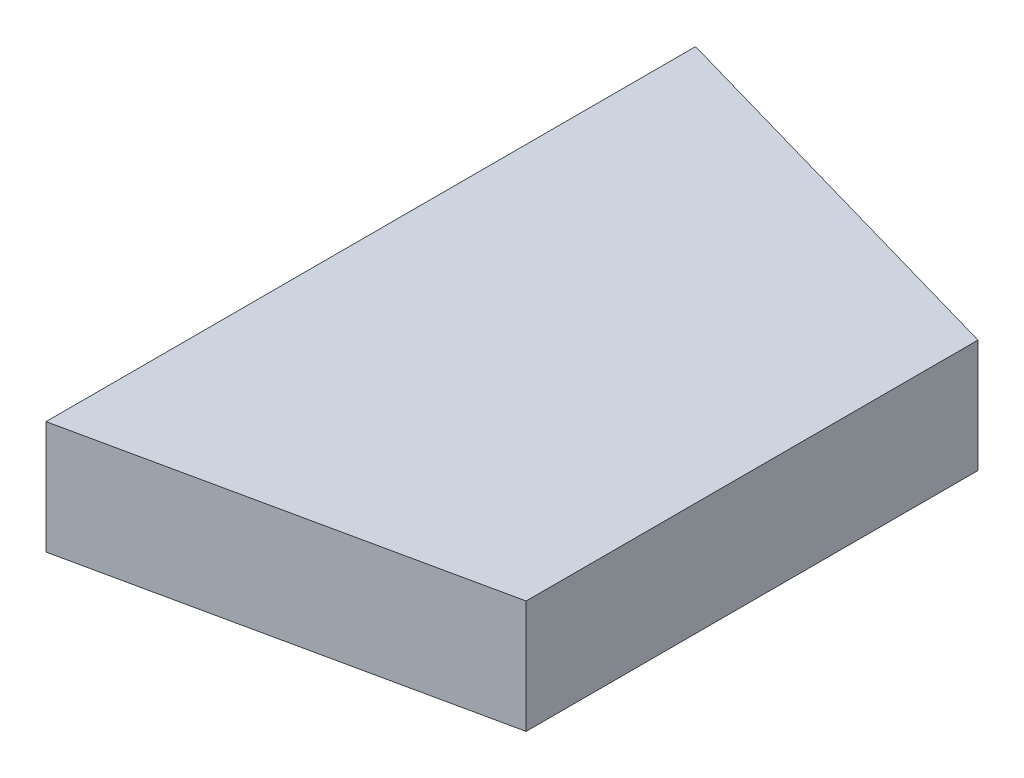
ISO-10303-21;
HEADER;
FILE_DESCRIPTION(('STEP AP214'),'2;1');
FILE_NAME('part.step','',(''),(''),'','','');
FILE_SCHEMA(('AUTOMOTIVE_DESIGN { 1 0 10303 214 1 1 1 1 }'));
ENDSEC;
DATA;
#1=APPLICATION_CONTEXT('core data for automotive mechanical design processes');
#2=APPLICATION_PROTOCOL_DEFINITION('international standard','automotive_design',2000,#1);
#3=PRODUCT_CONTEXT('',#1,'mechanical');
#4=PRODUCT('Part','Part','',(#3));
#5=PRODUCT_RELATED_PRODUCT_CATEGORY('part','',(#4));
#6=PRODUCT_DEFINITION_FORMATION('','',#4);
#7=PRODUCT_DEFINITION_CONTEXT('part definition',#1,'design');
#8=PRODUCT_DEFINITION('design','',#6,#7);
#9=PRODUCT_DEFINITION_SHAPE('','',#8);
#10=(LENGTH_UNIT() NAMED_UNIT(*) SI_UNIT(.MILLI.,.METRE.));
#11=(NAMED_UNIT(*) PLANE_ANGLE_UNIT() SI_UNIT($,.RADIAN.));
#12=(NAMED_UNIT(*) SI_UNIT($,.STERADIAN.) SOLID_ANGLE_UNIT());
#13=UNCERTAINTY_MEASURE_WITH_UNIT(LENGTH_MEASURE(1.E-05),#10,'distance_accuracy_value','');
#14=(GEOMETRIC_REPRESENTATION_CONTEXT(3) GLOBAL_UNCERTAINTY_ASSIGNED_CONTEXT((#13)) GLOBAL_UNIT_ASSIGNED_CONTEXT((#10,
#11,#12)) REPRESENTATION_CONTEXT('',''));
#15=CARTESIAN_POINT('',(0.,0.,0.));
#16=DIRECTION('',(0.,0.,1.));
#17=DIRECTION('',(1.,0.,0.));
#18=AXIS2_PLACEMENT_3D('',#15,#16,#17);
#19=CARTESIAN_POINT('',(0.,-4.,0.));
#20=DIRECTION('',(0.,-1.,0.));
#21=DIRECTION('',(0.,0.,-1.));
#22=AXIS2_PLACEMENT_3D('',#19,#20,#21);
#23=PLANE('',#22);
#24=CARTESIAN_POINT('',(80.,-4.,62.));
#25=DIRECTION('',(0.,1.,0.));
#26=DIRECTION('',(0.,0.,1.));
#27=AXIS2_PLACEMENT_3D('',#24,#25,#26);
#28=CIRCLE('',#27,3.00000000000001);
#29=CARTESIAN_POINT('',(80.,-4.,65.));
#30=VERTEX_POINT('',#29);
#31=EDGE_CURVE('E150',#30,#30,#28,.T.);
#32=ORIENTED_EDGE('',*,*,#31,.T.);
#33=EDGE_LOOP('',(#32));
#34=FACE_BOUND('',#33,.T.);
#35=CARTESIAN_POINT('',(100.,-4.,50.));
#36=DIRECTION('',(0.,1.,0.));
#37=DIRECTION('',(0.,0.,1.));
#38=AXIS2_PLACEMENT_3D('',#35,#36,#37);
#39=CIRCLE('',#38,3.00000000000001);
#40=CARTESIAN_POINT('',(100.,-4.,53.));
#41=VERTEX_POINT('',#40);
#42=EDGE_CURVE('E146',#41,#41,#39,.T.);
#43=ORIENTED_EDGE('',*,*,#42,.T.);
#44=EDGE_LOOP('',(#43));
#45=FACE_BOUND('',#44,.T.);
#46=DIRECTION('',(-0.961523947640823,0.,-0.274721127897378));
#47=VECTOR('',#46,1.);
#48=CARTESIAN_POINT('',(76.,-4.,20.));
#49=LINE('',#48,#47);
#50=CARTESIAN_POINT('',(79.5957594205331,-4.,21.027359834438));
#51=VERTEX_POINT('',#50);
#52=CARTESIAN_POINT('',(76.,-4.,20.));
#53=VERTEX_POINT('',#52);
#54=EDGE_CURVE('E118',#51,#53,#49,.T.);
#55=ORIENTED_EDGE('',*,*,#54,.F.);
#56=CARTESIAN_POINT('',(80.,-4.,24.));
#57=DIRECTION('',(0.,1.,0.));
#58=DIRECTION('',(0.,0.,1.));
#59=AXIS2_PLACEMENT_3D('',#56,#57,#58);
#60=CIRCLE('',#59,3.00000000000001);
#61=CARTESIAN_POINT('',(81.9136745417311,-4.,21.6896212976375));
#62=VERTEX_POINT('',#61);
#63=EDGE_CURVE('E47',#51,#62,#60,.T.);
#64=ORIENTED_EDGE('',*,*,#63,.T.);
#65=CARTESIAN_POINT('',(104.,-4.,28.));
#66=VERTEX_POINT('',#65);
#67=EDGE_CURVE('E113',#66,#62,#49,.T.);
#68=ORIENTED_EDGE('',*,*,#67,.F.);
#69=DIRECTION('',(0.,0.,-1.));
#70=VECTOR('',#69,1.);
#71=CARTESIAN_POINT('',(104.,-4.,28.));
#72=LINE('',#71,#70);
#73=CARTESIAN_POINT('',(104.,-4.,60.));
#74=VERTEX_POINT('',#73);
#75=EDGE_CURVE('E127',#74,#66,#72,.T.);
#76=ORIENTED_EDGE('',*,*,#75,.F.);
#77=DIRECTION('',(0.977802414077409,0.,-0.209529088730874));
#78=VECTOR('',#77,1.);
#79=CARTESIAN_POINT('',(104.,-4.,60.));
#80=LINE('',#79,#78);
#81=CARTESIAN_POINT('',(76.,-4.,66.));
#82=VERTEX_POINT('',#81);
#83=EDGE_CURVE('E108',#82,#74,#80,.T.);
#84=ORIENTED_EDGE('',*,*,#83,.F.);
#85=DIRECTION('',(0.,0.,1.));
#86=VECTOR('',#85,1.);
#87=CARTESIAN_POINT('',(76.,-4.,66.));
#88=LINE('',#87,#86);
#89=EDGE_CURVE('E83',#53,#82,#88,.T.);
#90=ORIENTED_EDGE('',*,*,#89,.F.);
#91=EDGE_LOOP('',(#55,#64,#68,#76,#84,#90));
#92=FACE_BOUND('',#91,.T.);
#93=ADVANCED_FACE('F41',(#34,#45,#92),#23,.T.);
#94=CARTESIAN_POINT('',(104.,4.,60.));
#95=DIRECTION('',(-0.209529088730874,0.,-0.97780241407741));
#96=DIRECTION('',(-0.97780241407741,0.,0.209529088730874));
#97=AXIS2_PLACEMENT_3D('',#94,#95,#96);
#98=PLANE('',#97);
#99=ORIENTED_EDGE('',*,*,#83,.T.);
#100=DIRECTION('',(0.,-1.,0.));
#101=VECTOR('',#100,1.);
#102=CARTESIAN_POINT('',(104.,4.,60.));
#103=LINE('',#102,#101);
#104=CARTESIAN_POINT('',(104.,4.,60.));
#105=VERTEX_POINT('',#104);
#106=EDGE_CURVE('E119',#105,#74,#103,.T.);
#107=ORIENTED_EDGE('',*,*,#106,.F.);
#108=DIRECTION('',(0.977802414077409,0.,-0.209529088730874));
#109=VECTOR('',#108,1.);
#110=CARTESIAN_POINT('',(104.,4.,60.));
#111=LINE('',#110,#109);
#112=CARTESIAN_POINT('',(76.,4.,66.));
#113=VERTEX_POINT('',#112);
#114=EDGE_CURVE('E121',#113,#105,#111,.T.);
#115=ORIENTED_EDGE('',*,*,#114,.F.);
#116=DIRECTION('',(0.,-1.,0.));
#117=VECTOR('',#116,1.);
#118=CARTESIAN_POINT('',(76.,4.,66.));
#119=LINE('',#118,#117);
#120=EDGE_CURVE('E128',#113,#82,#119,.T.);
#121=ORIENTED_EDGE('',*,*,#120,.T.);
#122=EDGE_LOOP('',(#99,#107,#115,#121));
#123=FACE_BOUND('',#122,.T.);
#124=ADVANCED_FACE('F43',(#123),#98,.F.);
#125=CARTESIAN_POINT('',(104.,4.,28.));
#126=DIRECTION('',(-1.,0.,0.));
#127=DIRECTION('',(0.,0.,1.));
#128=AXIS2_PLACEMENT_3D('',#125,#126,#127);
#129=PLANE('',#128);
#130=ORIENTED_EDGE('',*,*,#75,.T.);
#131=DIRECTION('',(0.,-1.,0.));
#132=VECTOR('',#131,1.);
#133=CARTESIAN_POINT('',(104.,4.,28.));
#134=LINE('',#133,#132);
#135=CARTESIAN_POINT('',(104.,4.,28.));
#136=VERTEX_POINT('',#135);
#137=EDGE_CURVE('E124',#136,#66,#134,.T.);
#138=ORIENTED_EDGE('',*,*,#137,.F.);
#139=DIRECTION('',(0.,0.,-1.));
#140=VECTOR('',#139,1.);
#141=CARTESIAN_POINT('',(104.,4.,28.));
#142=LINE('',#141,#140);
#143=EDGE_CURVE('E91',#105,#136,#142,.T.);
#144=ORIENTED_EDGE('',*,*,#143,.F.);
#145=ORIENTED_EDGE('',*,*,#106,.T.);
#146=EDGE_LOOP('',(#130,#138,#144,#145));
#147=FACE_BOUND('',#146,.T.);
#148=ADVANCED_FACE('F137',(#147),#129,.F.);
#149=CARTESIAN_POINT('',(76.,4.,20.));
#150=DIRECTION('',(-0.274721127897378,0.,0.961523947640823));
#151=DIRECTION('',(0.961523947640823,0.,0.274721127897378));
#152=AXIS2_PLACEMENT_3D('',#149,#150,#151);
#153=PLANE('',#152);
#154=ORIENTED_EDGE('',*,*,#67,.T.);
#155=DIRECTION('',(0.,1.,0.));
#156=VECTOR('',#155,1.);
#157=CARTESIAN_POINT('',(81.9136745417311,-4.,21.6896212976374));
#158=LINE('',#157,#156);
#159=CARTESIAN_POINT('',(81.9136745417311,0.,21.6896212976374));
#160=VERTEX_POINT('',#159);
#161=EDGE_CURVE('E103',#62,#160,#158,.T.);
#162=ORIENTED_EDGE('',*,*,#161,.T.);
#163=DIRECTION('',(-0.961523947640823,0.,-0.274721127897378));
#164=VECTOR('',#163,1.);
#165=CARTESIAN_POINT('',(76.,0.,20.));
#166=LINE('',#165,#164);
#167=CARTESIAN_POINT('',(79.5957594205331,0.,21.027359834438));
#168=VERTEX_POINT('',#167);
#169=EDGE_CURVE('E11',#160,#168,#166,.T.);
#170=ORIENTED_EDGE('',*,*,#169,.T.);
#171=DIRECTION('',(0.,1.,0.));
#172=VECTOR('',#171,1.);
#173=CARTESIAN_POINT('',(79.5957594205331,-4.,21.027359834438));
#174=LINE('',#173,#172);
#175=EDGE_CURVE('E109',#168,#51,#174,.F.);
#176=ORIENTED_EDGE('',*,*,#175,.T.);
#177=ORIENTED_EDGE('',*,*,#54,.T.);
#178=DIRECTION('',(0.,-1.,0.));
#179=VECTOR('',#178,1.);
#180=CARTESIAN_POINT('',(76.,4.,20.));
#181=LINE('',#180,#179);
#182=CARTESIAN_POINT('',(76.,4.,20.));
#183=VERTEX_POINT('',#182);
#184=EDGE_CURVE('E134',#183,#53,#181,.T.);
#185=ORIENTED_EDGE('',*,*,#184,.F.);
#186=DIRECTION('',(-0.961523947640823,0.,-0.274721127897378));
#187=VECTOR('',#186,1.);
#188=CARTESIAN_POINT('',(76.,4.,20.));
#189=LINE('',#188,#187);
#190=EDGE_CURVE('E142',#136,#183,#189,.T.);
#191=ORIENTED_EDGE('',*,*,#190,.F.);
#192=ORIENTED_EDGE('',*,*,#137,.T.);
#193=EDGE_LOOP('',(#154,#162,#170,#176,#177,#185,#191,#192));
#194=FACE_BOUND('',#193,.T.);
#195=ADVANCED_FACE('F116',(#194),#153,.F.);
#196=CARTESIAN_POINT('',(76.,4.,66.));
#197=DIRECTION('',(1.,0.,0.));
#198=DIRECTION('',(0.,0.,-1.));
#199=AXIS2_PLACEMENT_3D('',#196,#197,#198);
#200=PLANE('',#199);
#201=ORIENTED_EDGE('',*,*,#89,.T.);
#202=ORIENTED_EDGE('',*,*,#120,.F.);
#203=DIRECTION('',(0.,0.,1.));
#204=VECTOR('',#203,1.);
#205=CARTESIAN_POINT('',(76.,4.,66.));
#206=LINE('',#205,#204);
#207=EDGE_CURVE('E65',#183,#113,#206,.T.);
#208=ORIENTED_EDGE('',*,*,#207,.F.);
#209=ORIENTED_EDGE('',*,*,#184,.T.);
#210=EDGE_LOOP('',(#201,#202,#208,#209));
#211=FACE_BOUND('',#210,.T.);
#212=ADVANCED_FACE('F190',(#211),#200,.F.);
#213=CARTESIAN_POINT('',(0.,4.,0.));
#214=DIRECTION('',(0.,-1.,0.));
#215=DIRECTION('',(0.,0.,-1.));
#216=AXIS2_PLACEMENT_3D('',#213,#214,#215);
#217=PLANE('',#216);
#218=ORIENTED_EDGE('',*,*,#114,.T.);
#219=ORIENTED_EDGE('',*,*,#143,.T.);
#220=ORIENTED_EDGE('',*,*,#190,.T.);
#221=ORIENTED_EDGE('',*,*,#207,.T.);
#222=EDGE_LOOP('',(#218,#219,#220,#221));
#223=FACE_BOUND('',#222,.T.);
#224=ADVANCED_FACE('F189',(#223),#217,.F.);
#225=CARTESIAN_POINT('',(100.,-4.,50.));
#226=DIRECTION('',(0.,1.,0.));
#227=DIRECTION('',(0.,0.,1.));
#228=AXIS2_PLACEMENT_3D('',#225,#226,#227);
#229=CYLINDRICAL_SURFACE('',#228,3.00000000000001);
#230=ORIENTED_EDGE('',*,*,#42,.F.);
#231=EDGE_LOOP('',(#230));
#232=FACE_BOUND('',#231,.T.);
#233=CARTESIAN_POINT('',(100.,0.,50.));
#234=DIRECTION('',(0.,1.,0.));
#235=DIRECTION('',(0.,0.,1.));
#236=AXIS2_PLACEMENT_3D('',#233,#234,#235);
#237=CIRCLE('',#236,3.00000000000001);
#238=CARTESIAN_POINT('',(100.,0.,53.));
#239=VERTEX_POINT('',#238);
#240=EDGE_CURVE('E151',#239,#239,#237,.T.);
#241=ORIENTED_EDGE('',*,*,#240,.T.);
#242=EDGE_LOOP('',(#241));
#243=FACE_BOUND('',#242,.T.);
#244=ADVANCED_FACE('F208',(#232,#243),#229,.F.);
#245=CARTESIAN_POINT('',(100.,0.,50.));
#246=DIRECTION('',(0.,1.,0.));
#247=DIRECTION('',(0.,0.,1.));
#248=AXIS2_PLACEMENT_3D('',#245,#246,#247);
#249=PLANE('',#248);
#250=ORIENTED_EDGE('',*,*,#240,.F.);
#251=EDGE_LOOP('',(#250));
#252=FACE_BOUND('',#251,.T.);
#253=ADVANCED_FACE('F170',(#252),#249,.F.);
#254=CARTESIAN_POINT('',(80.,-4.,62.));
#255=DIRECTION('',(0.,1.,0.));
#256=DIRECTION('',(0.,0.,1.));
#257=AXIS2_PLACEMENT_3D('',#254,#255,#256);
#258=CYLINDRICAL_SURFACE('',#257,3.00000000000001);
#259=ORIENTED_EDGE('',*,*,#31,.F.);
#260=EDGE_LOOP('',(#259));
#261=FACE_BOUND('',#260,.T.);
#262=CARTESIAN_POINT('',(80.,0.,62.));
#263=DIRECTION('',(0.,1.,0.));
#264=DIRECTION('',(0.,0.,1.));
#265=AXIS2_PLACEMENT_3D('',#262,#263,#264);
#266=CIRCLE('',#265,3.00000000000001);
#267=CARTESIAN_POINT('',(80.,0.,65.));
#268=VERTEX_POINT('',#267);
#269=EDGE_CURVE('E154',#268,#268,#266,.T.);
#270=ORIENTED_EDGE('',*,*,#269,.T.);
#271=EDGE_LOOP('',(#270));
#272=FACE_BOUND('',#271,.T.);
#273=ADVANCED_FACE('F162',(#261,#272),#258,.F.);
#274=CARTESIAN_POINT('',(80.,0.,62.));
#275=DIRECTION('',(0.,1.,0.));
#276=DIRECTION('',(0.,0.,1.));
#277=AXIS2_PLACEMENT_3D('',#274,#275,#276);
#278=PLANE('',#277);
#279=ORIENTED_EDGE('',*,*,#269,.F.);
#280=EDGE_LOOP('',(#279));
#281=FACE_BOUND('',#280,.T.);
#282=ADVANCED_FACE('F167',(#281),#278,.F.);
#283=CARTESIAN_POINT('',(80.,0.,24.));
#284=DIRECTION('',(0.,1.,0.));
#285=DIRECTION('',(0.,0.,1.));
#286=AXIS2_PLACEMENT_3D('',#283,#284,#285);
#287=PLANE('',#286);
#288=CARTESIAN_POINT('',(80.,0.,24.));
#289=DIRECTION('',(0.,1.,0.));
#290=DIRECTION('',(0.,0.,1.));
#291=AXIS2_PLACEMENT_3D('',#288,#289,#290);
#292=CIRCLE('',#291,3.00000000000001);
#293=EDGE_CURVE('E54',#168,#160,#292,.T.);
#294=ORIENTED_EDGE('',*,*,#293,.F.);
#295=ORIENTED_EDGE('',*,*,#169,.F.);
#296=EDGE_LOOP('',(#294,#295));
#297=FACE_BOUND('',#296,.T.);
#298=ADVANCED_FACE('F174',(#297),#287,.F.);
#299=CARTESIAN_POINT('',(80.,-4.,24.));
#300=DIRECTION('',(0.,1.,0.));
#301=DIRECTION('',(0.,0.,1.));
#302=AXIS2_PLACEMENT_3D('',#299,#300,#301);
#303=CYLINDRICAL_SURFACE('',#302,3.00000000000001);
#304=ORIENTED_EDGE('',*,*,#63,.F.);
#305=ORIENTED_EDGE('',*,*,#175,.F.);
#306=ORIENTED_EDGE('',*,*,#293,.T.);
#307=ORIENTED_EDGE('',*,*,#161,.F.);
#308=EDGE_LOOP('',(#304,#305,#306,#307));
#309=FACE_BOUND('',#308,.T.);
#310=ADVANCED_FACE('F104',(#309),#303,.F.);
#311=CLOSED_SHELL('',(#93,#124,#148,#195,#212,#224,#244,#253,#273,#282,#298,#310));
#312=MANIFOLD_SOLID_BREP('B2',#311);
#313=ADVANCED_BREP_SHAPE_REPRESENTATION('',(#18,#312),#14);
#314=SHAPE_DEFINITION_REPRESENTATION(#9,#313);
ENDSEC;
END-ISO-10303-21;
